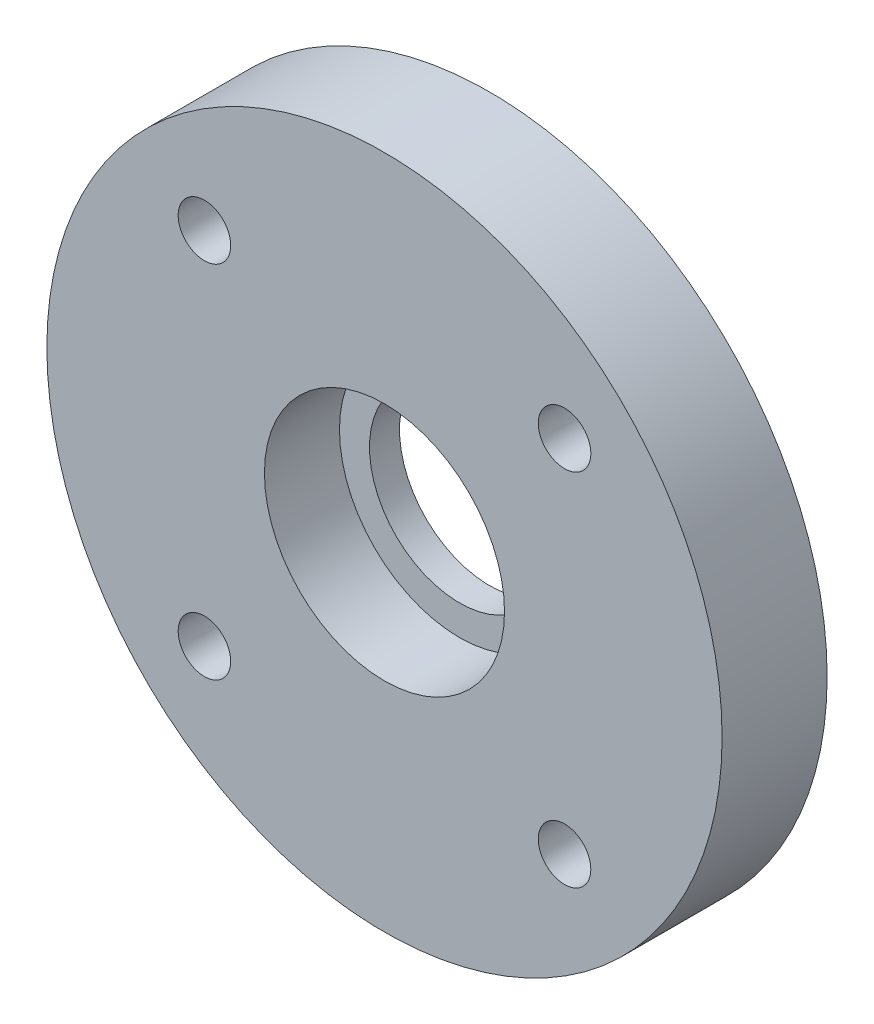
ISO-10303-21;
HEADER;
FILE_DESCRIPTION(('STEP AP214'),'2;1');
FILE_NAME('part.step','',(''),(''),'','','');
FILE_SCHEMA(('AUTOMOTIVE_DESIGN { 1 0 10303 214 1 1 1 1 }'));
ENDSEC;
DATA;
#1=APPLICATION_CONTEXT('core data for automotive mechanical design processes');
#2=APPLICATION_PROTOCOL_DEFINITION('international standard','automotive_design',2000,#1);
#3=PRODUCT_CONTEXT('',#1,'mechanical');
#4=PRODUCT('Part','Part','',(#3));
#5=PRODUCT_RELATED_PRODUCT_CATEGORY('part','',(#4));
#6=PRODUCT_DEFINITION_FORMATION('','',#4);
#7=PRODUCT_DEFINITION_CONTEXT('part definition',#1,'design');
#8=PRODUCT_DEFINITION('design','',#6,#7);
#9=PRODUCT_DEFINITION_SHAPE('','',#8);
#10=(LENGTH_UNIT() NAMED_UNIT(*) SI_UNIT(.MILLI.,.METRE.));
#11=(NAMED_UNIT(*) PLANE_ANGLE_UNIT() SI_UNIT($,.RADIAN.));
#12=(NAMED_UNIT(*) SI_UNIT($,.STERADIAN.) SOLID_ANGLE_UNIT());
#13=UNCERTAINTY_MEASURE_WITH_UNIT(LENGTH_MEASURE(1.E-05),#10,'distance_accuracy_value','');
#14=(GEOMETRIC_REPRESENTATION_CONTEXT(3) GLOBAL_UNCERTAINTY_ASSIGNED_CONTEXT((#13)) GLOBAL_UNIT_ASSIGNED_CONTEXT((#10,
#11,#12)) REPRESENTATION_CONTEXT('',''));
#15=CARTESIAN_POINT('',(0.,0.,0.));
#16=DIRECTION('',(0.,0.,1.));
#17=DIRECTION('',(1.,0.,0.));
#18=AXIS2_PLACEMENT_3D('',#15,#16,#17);
#19=CARTESIAN_POINT('',(0.,0.,7.));
#20=DIRECTION('',(0.,0.,-1.));
#21=DIRECTION('',(-1.,0.,0.));
#22=AXIS2_PLACEMENT_3D('',#19,#20,#21);
#23=CYLINDRICAL_SURFACE('',#22,6.);
#24=CARTESIAN_POINT('',(0.,0.,0.));
#25=DIRECTION('',(0.,0.,1.));
#26=DIRECTION('',(1.,0.,0.));
#27=AXIS2_PLACEMENT_3D('',#24,#25,#26);
#28=CIRCLE('',#27,6.);
#29=CARTESIAN_POINT('',(6.,0.,0.));
#30=VERTEX_POINT('',#29);
#31=EDGE_CURVE('E44',#30,#30,#28,.T.);
#32=ORIENTED_EDGE('',*,*,#31,.F.);
#33=EDGE_LOOP('',(#32));
#34=FACE_BOUND('',#33,.T.);
#35=CARTESIAN_POINT('',(0.,0.,2.));
#36=DIRECTION('',(0.,0.,1.));
#37=DIRECTION('',(1.,0.,0.));
#38=AXIS2_PLACEMENT_3D('',#35,#36,#37);
#39=CIRCLE('',#38,6.);
#40=CARTESIAN_POINT('',(6.,0.,2.));
#41=VERTEX_POINT('',#40);
#42=EDGE_CURVE('E35',#41,#41,#39,.T.);
#43=ORIENTED_EDGE('',*,*,#42,.T.);
#44=EDGE_LOOP('',(#43));
#45=FACE_BOUND('',#44,.T.);
#46=ADVANCED_FACE('F31',(#34,#45),#23,.F.);
#47=CARTESIAN_POINT('',(0.,0.,7.));
#48=DIRECTION('',(0.,0.,1.));
#49=DIRECTION('',(1.,0.,0.));
#50=AXIS2_PLACEMENT_3D('',#47,#48,#49);
#51=PLANE('',#50);
#52=CARTESIAN_POINT('',(-12.,-12.,7.));
#53=DIRECTION('',(0.,0.,1.));
#54=DIRECTION('',(-1.,0.,0.));
#55=AXIS2_PLACEMENT_3D('',#52,#53,#54);
#56=CIRCLE('',#55,1.75);
#57=CARTESIAN_POINT('',(-13.75,-12.,7.));
#58=VERTEX_POINT('',#57);
#59=EDGE_CURVE('E73',#58,#58,#56,.T.);
#60=ORIENTED_EDGE('',*,*,#59,.F.);
#61=EDGE_LOOP('',(#60));
#62=FACE_BOUND('',#61,.T.);
#63=CARTESIAN_POINT('',(12.,-12.,7.));
#64=DIRECTION('',(0.,0.,1.));
#65=DIRECTION('',(1.,0.,0.));
#66=AXIS2_PLACEMENT_3D('',#63,#64,#65);
#67=CIRCLE('',#66,1.75);
#68=CARTESIAN_POINT('',(13.75,-12.,7.));
#69=VERTEX_POINT('',#68);
#70=EDGE_CURVE('E67',#69,#69,#67,.T.);
#71=ORIENTED_EDGE('',*,*,#70,.F.);
#72=EDGE_LOOP('',(#71));
#73=FACE_BOUND('',#72,.T.);
#74=CARTESIAN_POINT('',(12.,12.,7.));
#75=DIRECTION('',(0.,0.,1.));
#76=DIRECTION('',(-1.,0.,0.));
#77=AXIS2_PLACEMENT_3D('',#74,#75,#76);
#78=CIRCLE('',#77,1.75);
#79=CARTESIAN_POINT('',(10.25,12.,7.));
#80=VERTEX_POINT('',#79);
#81=EDGE_CURVE('E61',#80,#80,#78,.T.);
#82=ORIENTED_EDGE('',*,*,#81,.F.);
#83=EDGE_LOOP('',(#82));
#84=FACE_BOUND('',#83,.T.);
#85=CARTESIAN_POINT('',(-12.,12.,7.));
#86=DIRECTION('',(0.,0.,1.));
#87=DIRECTION('',(1.,0.,0.));
#88=AXIS2_PLACEMENT_3D('',#85,#86,#87);
#89=CIRCLE('',#88,1.75);
#90=CARTESIAN_POINT('',(-10.25,12.,7.));
#91=VERTEX_POINT('',#90);
#92=EDGE_CURVE('E55',#91,#91,#89,.T.);
#93=ORIENTED_EDGE('',*,*,#92,.F.);
#94=EDGE_LOOP('',(#93));
#95=FACE_BOUND('',#94,.T.);
#96=CARTESIAN_POINT('',(0.,0.,7.));
#97=DIRECTION('',(0.,0.,1.));
#98=DIRECTION('',(1.,0.,0.));
#99=AXIS2_PLACEMENT_3D('',#96,#97,#98);
#100=CIRCLE('',#99,8.);
#101=CARTESIAN_POINT('',(8.,0.,7.));
#102=VERTEX_POINT('',#101);
#103=EDGE_CURVE('E48',#102,#102,#100,.T.);
#104=ORIENTED_EDGE('',*,*,#103,.F.);
#105=EDGE_LOOP('',(#104));
#106=FACE_BOUND('',#105,.T.);
#107=CARTESIAN_POINT('',(0.,0.,7.));
#108=DIRECTION('',(0.,0.,1.));
#109=DIRECTION('',(1.,0.,0.));
#110=AXIS2_PLACEMENT_3D('',#107,#108,#109);
#111=CIRCLE('',#110,22.5);
#112=CARTESIAN_POINT('',(22.5,0.,7.));
#113=VERTEX_POINT('',#112);
#114=EDGE_CURVE('E10',#113,#113,#111,.T.);
#115=ORIENTED_EDGE('',*,*,#114,.T.);
#116=EDGE_LOOP('',(#115));
#117=FACE_BOUND('',#116,.T.);
#118=ADVANCED_FACE('F89',(#62,#73,#84,#95,#106,#117),#51,.T.);
#119=CARTESIAN_POINT('',(0.,0.,0.));
#120=DIRECTION('',(0.,0.,1.));
#121=DIRECTION('',(1.,0.,0.));
#122=AXIS2_PLACEMENT_3D('',#119,#120,#121);
#123=PLANE('',#122);
#124=CARTESIAN_POINT('',(-12.,-12.,0.));
#125=DIRECTION('',(0.,0.,1.));
#126=DIRECTION('',(-1.,0.,0.));
#127=AXIS2_PLACEMENT_3D('',#124,#125,#126);
#128=CIRCLE('',#127,1.75);
#129=CARTESIAN_POINT('',(-13.75,-12.,0.));
#130=VERTEX_POINT('',#129);
#131=EDGE_CURVE('E70',#130,#130,#128,.T.);
#132=ORIENTED_EDGE('',*,*,#131,.T.);
#133=EDGE_LOOP('',(#132));
#134=FACE_BOUND('',#133,.T.);
#135=CARTESIAN_POINT('',(12.,-12.,0.));
#136=DIRECTION('',(0.,0.,1.));
#137=DIRECTION('',(1.,0.,0.));
#138=AXIS2_PLACEMENT_3D('',#135,#136,#137);
#139=CIRCLE('',#138,1.75);
#140=CARTESIAN_POINT('',(13.75,-12.,0.));
#141=VERTEX_POINT('',#140);
#142=EDGE_CURVE('E64',#141,#141,#139,.T.);
#143=ORIENTED_EDGE('',*,*,#142,.T.);
#144=EDGE_LOOP('',(#143));
#145=FACE_BOUND('',#144,.T.);
#146=CARTESIAN_POINT('',(12.,12.,0.));
#147=DIRECTION('',(0.,0.,1.));
#148=DIRECTION('',(-1.,0.,0.));
#149=AXIS2_PLACEMENT_3D('',#146,#147,#148);
#150=CIRCLE('',#149,1.75);
#151=CARTESIAN_POINT('',(10.25,12.,0.));
#152=VERTEX_POINT('',#151);
#153=EDGE_CURVE('E58',#152,#152,#150,.T.);
#154=ORIENTED_EDGE('',*,*,#153,.T.);
#155=EDGE_LOOP('',(#154));
#156=FACE_BOUND('',#155,.T.);
#157=CARTESIAN_POINT('',(-12.,12.,0.));
#158=DIRECTION('',(0.,0.,1.));
#159=DIRECTION('',(1.,0.,0.));
#160=AXIS2_PLACEMENT_3D('',#157,#158,#159);
#161=CIRCLE('',#160,1.75);
#162=CARTESIAN_POINT('',(-10.25,12.,0.));
#163=VERTEX_POINT('',#162);
#164=EDGE_CURVE('E52',#163,#163,#161,.T.);
#165=ORIENTED_EDGE('',*,*,#164,.T.);
#166=EDGE_LOOP('',(#165));
#167=FACE_BOUND('',#166,.T.);
#168=CARTESIAN_POINT('',(0.,0.,0.));
#169=DIRECTION('',(0.,0.,1.));
#170=DIRECTION('',(1.,0.,0.));
#171=AXIS2_PLACEMENT_3D('',#168,#169,#170);
#172=CIRCLE('',#171,22.5);
#173=CARTESIAN_POINT('',(22.5,0.,0.));
#174=VERTEX_POINT('',#173);
#175=EDGE_CURVE('E39',#174,#174,#172,.T.);
#176=ORIENTED_EDGE('',*,*,#175,.F.);
#177=EDGE_LOOP('',(#176));
#178=FACE_BOUND('',#177,.T.);
#179=ORIENTED_EDGE('',*,*,#31,.T.);
#180=EDGE_LOOP('',(#179));
#181=FACE_BOUND('',#180,.T.);
#182=ADVANCED_FACE('F79',(#134,#145,#156,#167,#178,#181),#123,.F.);
#183=CARTESIAN_POINT('',(0.,0.,7.));
#184=DIRECTION('',(0.,0.,-1.));
#185=DIRECTION('',(-1.,0.,0.));
#186=AXIS2_PLACEMENT_3D('',#183,#184,#185);
#187=CYLINDRICAL_SURFACE('',#186,22.5);
#188=ORIENTED_EDGE('',*,*,#114,.F.);
#189=EDGE_LOOP('',(#188));
#190=FACE_BOUND('',#189,.T.);
#191=ORIENTED_EDGE('',*,*,#175,.T.);
#192=EDGE_LOOP('',(#191));
#193=FACE_BOUND('',#192,.T.);
#194=ADVANCED_FACE('F33',(#190,#193),#187,.T.);
#195=CARTESIAN_POINT('',(0.,0.,2.));
#196=DIRECTION('',(0.,0.,1.));
#197=DIRECTION('',(1.,0.,0.));
#198=AXIS2_PLACEMENT_3D('',#195,#196,#197);
#199=CYLINDRICAL_SURFACE('',#198,8.);
#200=CARTESIAN_POINT('',(0.,0.,2.));
#201=DIRECTION('',(0.,0.,1.));
#202=DIRECTION('',(1.,0.,0.));
#203=AXIS2_PLACEMENT_3D('',#200,#201,#202);
#204=CIRCLE('',#203,8.);
#205=CARTESIAN_POINT('',(8.,0.,2.));
#206=VERTEX_POINT('',#205);
#207=EDGE_CURVE('E51',#206,#206,#204,.T.);
#208=ORIENTED_EDGE('',*,*,#207,.F.);
#209=EDGE_LOOP('',(#208));
#210=FACE_BOUND('',#209,.T.);
#211=ORIENTED_EDGE('',*,*,#103,.T.);
#212=EDGE_LOOP('',(#211));
#213=FACE_BOUND('',#212,.T.);
#214=ADVANCED_FACE('F101',(#210,#213),#199,.F.);
#215=CARTESIAN_POINT('',(0.,0.,2.));
#216=DIRECTION('',(0.,0.,1.));
#217=DIRECTION('',(1.,0.,0.));
#218=AXIS2_PLACEMENT_3D('',#215,#216,#217);
#219=PLANE('',#218);
#220=ORIENTED_EDGE('',*,*,#42,.F.);
#221=EDGE_LOOP('',(#220));
#222=FACE_BOUND('',#221,.T.);
#223=ORIENTED_EDGE('',*,*,#207,.T.);
#224=EDGE_LOOP('',(#223));
#225=FACE_BOUND('',#224,.T.);
#226=ADVANCED_FACE('F103',(#222,#225),#219,.T.);
#227=CARTESIAN_POINT('',(-12.,12.,0.));
#228=DIRECTION('',(0.,0.,1.));
#229=DIRECTION('',(1.,0.,0.));
#230=AXIS2_PLACEMENT_3D('',#227,#228,#229);
#231=CYLINDRICAL_SURFACE('',#230,1.75);
#232=ORIENTED_EDGE('',*,*,#164,.F.);
#233=EDGE_LOOP('',(#232));
#234=FACE_BOUND('',#233,.T.);
#235=ORIENTED_EDGE('',*,*,#92,.T.);
#236=EDGE_LOOP('',(#235));
#237=FACE_BOUND('',#236,.T.);
#238=ADVANCED_FACE('F110',(#234,#237),#231,.F.);
#239=CARTESIAN_POINT('',(12.,12.,0.));
#240=DIRECTION('',(0.,0.,1.));
#241=DIRECTION('',(1.,0.,0.));
#242=AXIS2_PLACEMENT_3D('',#239,#240,#241);
#243=CYLINDRICAL_SURFACE('',#242,1.75);
#244=ORIENTED_EDGE('',*,*,#153,.F.);
#245=EDGE_LOOP('',(#244));
#246=FACE_BOUND('',#245,.T.);
#247=ORIENTED_EDGE('',*,*,#81,.T.);
#248=EDGE_LOOP('',(#247));
#249=FACE_BOUND('',#248,.T.);
#250=ADVANCED_FACE('F160',(#246,#249),#243,.F.);
#251=CARTESIAN_POINT('',(12.,-12.,0.));
#252=DIRECTION('',(0.,0.,1.));
#253=DIRECTION('',(1.,0.,0.));
#254=AXIS2_PLACEMENT_3D('',#251,#252,#253);
#255=CYLINDRICAL_SURFACE('',#254,1.75);
#256=ORIENTED_EDGE('',*,*,#142,.F.);
#257=EDGE_LOOP('',(#256));
#258=FACE_BOUND('',#257,.T.);
#259=ORIENTED_EDGE('',*,*,#70,.T.);
#260=EDGE_LOOP('',(#259));
#261=FACE_BOUND('',#260,.T.);
#262=ADVANCED_FACE('F85',(#258,#261),#255,.F.);
#263=CARTESIAN_POINT('',(-12.,-12.,0.));
#264=DIRECTION('',(0.,0.,1.));
#265=DIRECTION('',(1.,0.,0.));
#266=AXIS2_PLACEMENT_3D('',#263,#264,#265);
#267=CYLINDRICAL_SURFACE('',#266,1.75);
#268=ORIENTED_EDGE('',*,*,#131,.F.);
#269=EDGE_LOOP('',(#268));
#270=FACE_BOUND('',#269,.T.);
#271=ORIENTED_EDGE('',*,*,#59,.T.);
#272=EDGE_LOOP('',(#271));
#273=FACE_BOUND('',#272,.T.);
#274=ADVANCED_FACE('F82',(#270,#273),#267,.F.);
#275=CLOSED_SHELL('',(#46,#118,#182,#194,#214,#226,#238,#250,#262,#274));
#276=MANIFOLD_SOLID_BREP('B2',#275);
#277=ADVANCED_BREP_SHAPE_REPRESENTATION('',(#18,#276),#14);
#278=SHAPE_DEFINITION_REPRESENTATION(#9,#277);
ENDSEC;
END-ISO-10303-21;
